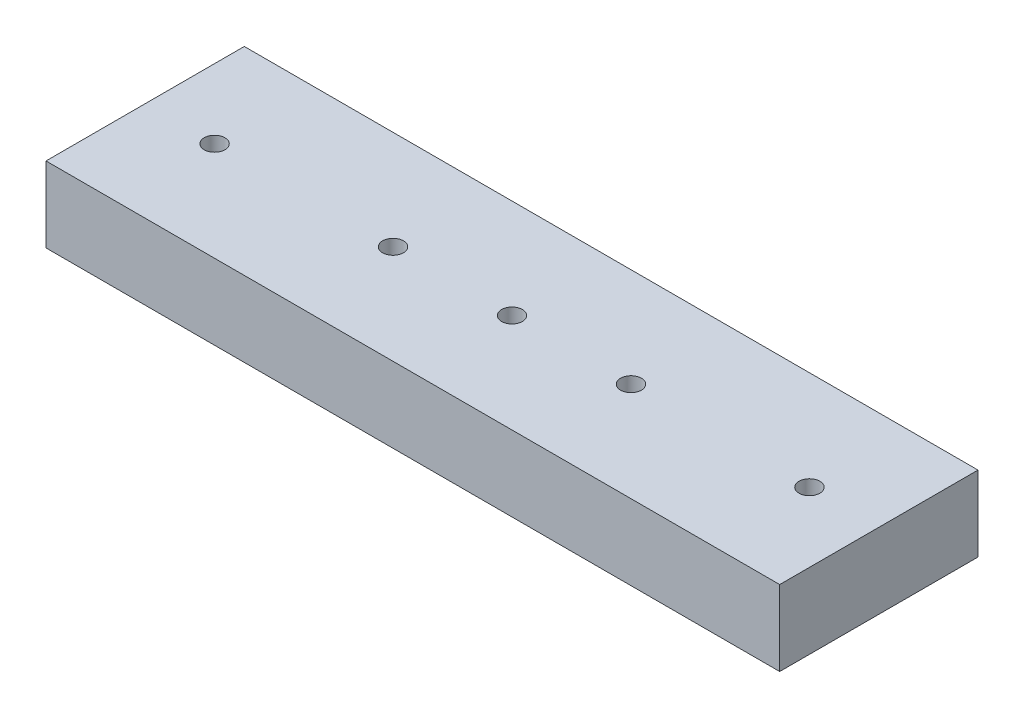
ISO-10303-21;
HEADER;
FILE_DESCRIPTION(('STEP AP214'),'2;1');
FILE_NAME('part.step','',(''),(''),'','','');
FILE_SCHEMA(('AUTOMOTIVE_DESIGN { 1 0 10303 214 1 1 1 1 }'));
ENDSEC;
DATA;
#1=APPLICATION_CONTEXT('core data for automotive mechanical design processes');
#2=APPLICATION_PROTOCOL_DEFINITION('international standard','automotive_design',2000,#1);
#3=PRODUCT_CONTEXT('',#1,'mechanical');
#4=PRODUCT('Part','Part','',(#3));
#5=PRODUCT_RELATED_PRODUCT_CATEGORY('part','',(#4));
#6=PRODUCT_DEFINITION_FORMATION('','',#4);
#7=PRODUCT_DEFINITION_CONTEXT('part definition',#1,'design');
#8=PRODUCT_DEFINITION('design','',#6,#7);
#9=PRODUCT_DEFINITION_SHAPE('','',#8);
#10=(LENGTH_UNIT() NAMED_UNIT(*) SI_UNIT(.MILLI.,.METRE.));
#11=(NAMED_UNIT(*) PLANE_ANGLE_UNIT() SI_UNIT($,.RADIAN.));
#12=(NAMED_UNIT(*) SI_UNIT($,.STERADIAN.) SOLID_ANGLE_UNIT());
#13=UNCERTAINTY_MEASURE_WITH_UNIT(LENGTH_MEASURE(1.E-05),#10,'distance_accuracy_value','');
#14=(GEOMETRIC_REPRESENTATION_CONTEXT(3) GLOBAL_UNCERTAINTY_ASSIGNED_CONTEXT((#13)) GLOBAL_UNIT_ASSIGNED_CONTEXT((#10,
#11,#12)) REPRESENTATION_CONTEXT('',''));
#15=CARTESIAN_POINT('',(0.,0.,0.));
#16=DIRECTION('',(0.,0.,1.));
#17=DIRECTION('',(1.,0.,0.));
#18=AXIS2_PLACEMENT_3D('',#15,#16,#17);
#19=CARTESIAN_POINT('',(-185.,38.,50.));
#20=DIRECTION('',(1.,0.,0.));
#21=DIRECTION('',(0.,0.,-1.));
#22=AXIS2_PLACEMENT_3D('',#19,#20,#21);
#23=PLANE('',#22);
#24=DIRECTION('',(0.,0.,1.));
#25=VECTOR('',#24,1.);
#26=CARTESIAN_POINT('',(-185.,0.,50.));
#27=LINE('',#26,#25);
#28=CARTESIAN_POINT('',(-185.,0.,-50.));
#29=VERTEX_POINT('',#28);
#30=CARTESIAN_POINT('',(-185.,0.,50.));
#31=VERTEX_POINT('',#30);
#32=EDGE_CURVE('E100',#29,#31,#27,.T.);
#33=ORIENTED_EDGE('',*,*,#32,.T.);
#34=DIRECTION('',(0.,-1.,0.));
#35=VECTOR('',#34,1.);
#36=CARTESIAN_POINT('',(-185.,38.,50.));
#37=LINE('',#36,#35);
#38=CARTESIAN_POINT('',(-185.,38.,50.));
#39=VERTEX_POINT('',#38);
#40=EDGE_CURVE('E11',#39,#31,#37,.T.);
#41=ORIENTED_EDGE('',*,*,#40,.F.);
#42=DIRECTION('',(0.,0.,1.));
#43=VECTOR('',#42,1.);
#44=CARTESIAN_POINT('',(-185.,38.,50.));
#45=LINE('',#44,#43);
#46=CARTESIAN_POINT('',(-185.,38.,-50.));
#47=VERTEX_POINT('',#46);
#48=EDGE_CURVE('E88',#47,#39,#45,.T.);
#49=ORIENTED_EDGE('',*,*,#48,.F.);
#50=DIRECTION('',(0.,-1.,0.));
#51=VECTOR('',#50,1.);
#52=CARTESIAN_POINT('',(-185.,38.,-50.));
#53=LINE('',#52,#51);
#54=EDGE_CURVE('E96',#47,#29,#53,.T.);
#55=ORIENTED_EDGE('',*,*,#54,.T.);
#56=EDGE_LOOP('',(#33,#41,#49,#55));
#57=FACE_BOUND('',#56,.T.);
#58=ADVANCED_FACE('F37',(#57),#23,.F.);
#59=CARTESIAN_POINT('',(185.,38.,50.));
#60=DIRECTION('',(0.,0.,-1.));
#61=DIRECTION('',(-1.,0.,0.));
#62=AXIS2_PLACEMENT_3D('',#59,#60,#61);
#63=PLANE('',#62);
#64=DIRECTION('',(1.,0.,0.));
#65=VECTOR('',#64,1.);
#66=CARTESIAN_POINT('',(185.,0.,50.));
#67=LINE('',#66,#65);
#68=CARTESIAN_POINT('',(185.,0.,50.));
#69=VERTEX_POINT('',#68);
#70=EDGE_CURVE('E92',#31,#69,#67,.T.);
#71=ORIENTED_EDGE('',*,*,#70,.T.);
#72=DIRECTION('',(0.,-1.,0.));
#73=VECTOR('',#72,1.);
#74=CARTESIAN_POINT('',(185.,38.,50.));
#75=LINE('',#74,#73);
#76=CARTESIAN_POINT('',(185.,38.,50.));
#77=VERTEX_POINT('',#76);
#78=EDGE_CURVE('E45',#77,#69,#75,.T.);
#79=ORIENTED_EDGE('',*,*,#78,.F.);
#80=DIRECTION('',(1.,0.,0.));
#81=VECTOR('',#80,1.);
#82=CARTESIAN_POINT('',(185.,38.,50.));
#83=LINE('',#82,#81);
#84=EDGE_CURVE('E83',#39,#77,#83,.T.);
#85=ORIENTED_EDGE('',*,*,#84,.F.);
#86=ORIENTED_EDGE('',*,*,#40,.T.);
#87=EDGE_LOOP('',(#71,#79,#85,#86));
#88=FACE_BOUND('',#87,.T.);
#89=ADVANCED_FACE('F91',(#88),#63,.F.);
#90=CARTESIAN_POINT('',(185.,38.,50.));
#91=DIRECTION('',(-1.,0.,0.));
#92=DIRECTION('',(0.,0.,1.));
#93=AXIS2_PLACEMENT_3D('',#90,#91,#92);
#94=PLANE('',#93);
#95=DIRECTION('',(0.,0.,-1.));
#96=VECTOR('',#95,1.);
#97=CARTESIAN_POINT('',(185.,0.,50.));
#98=LINE('',#97,#96);
#99=CARTESIAN_POINT('',(185.,0.,-50.));
#100=VERTEX_POINT('',#99);
#101=EDGE_CURVE('E70',#69,#100,#98,.T.);
#102=ORIENTED_EDGE('',*,*,#101,.T.);
#103=DIRECTION('',(0.,-1.,0.));
#104=VECTOR('',#103,1.);
#105=CARTESIAN_POINT('',(185.,38.,-50.));
#106=LINE('',#105,#104);
#107=CARTESIAN_POINT('',(185.,38.,-50.));
#108=VERTEX_POINT('',#107);
#109=EDGE_CURVE('E93',#108,#100,#106,.T.);
#110=ORIENTED_EDGE('',*,*,#109,.F.);
#111=DIRECTION('',(0.,0.,-1.));
#112=VECTOR('',#111,1.);
#113=CARTESIAN_POINT('',(185.,38.,50.));
#114=LINE('',#113,#112);
#115=EDGE_CURVE('E86',#77,#108,#114,.T.);
#116=ORIENTED_EDGE('',*,*,#115,.F.);
#117=ORIENTED_EDGE('',*,*,#78,.T.);
#118=EDGE_LOOP('',(#102,#110,#116,#117));
#119=FACE_BOUND('',#118,.T.);
#120=ADVANCED_FACE('F94',(#119),#94,.F.);
#121=CARTESIAN_POINT('',(185.,38.,-50.));
#122=DIRECTION('',(0.,0.,1.));
#123=DIRECTION('',(1.,0.,0.));
#124=AXIS2_PLACEMENT_3D('',#121,#122,#123);
#125=PLANE('',#124);
#126=DIRECTION('',(-1.,0.,0.));
#127=VECTOR('',#126,1.);
#128=CARTESIAN_POINT('',(185.,0.,-50.));
#129=LINE('',#128,#127);
#130=EDGE_CURVE('E76',#100,#29,#129,.T.);
#131=ORIENTED_EDGE('',*,*,#130,.T.);
#132=ORIENTED_EDGE('',*,*,#54,.F.);
#133=DIRECTION('',(-1.,0.,0.));
#134=VECTOR('',#133,1.);
#135=CARTESIAN_POINT('',(185.,38.,-50.));
#136=LINE('',#135,#134);
#137=EDGE_CURVE('E53',#108,#47,#136,.T.);
#138=ORIENTED_EDGE('',*,*,#137,.F.);
#139=ORIENTED_EDGE('',*,*,#109,.T.);
#140=EDGE_LOOP('',(#131,#132,#138,#139));
#141=FACE_BOUND('',#140,.T.);
#142=ADVANCED_FACE('F108',(#141),#125,.F.);
#143=CARTESIAN_POINT('',(0.,38.,0.));
#144=DIRECTION('',(0.,1.,0.));
#145=DIRECTION('',(0.,0.,1.));
#146=AXIS2_PLACEMENT_3D('',#143,#144,#145);
#147=PLANE('',#146);
#148=CARTESIAN_POINT('',(150.,38.,0.));
#149=DIRECTION('',(0.,1.,0.));
#150=DIRECTION('',(0.,0.,1.));
#151=AXIS2_PLACEMENT_3D('',#148,#149,#150);
#152=CIRCLE('',#151,5.25);
#153=CARTESIAN_POINT('',(150.,38.,5.24999999999996));
#154=VERTEX_POINT('',#153);
#155=EDGE_CURVE('E137',#154,#154,#152,.T.);
#156=ORIENTED_EDGE('',*,*,#155,.F.);
#157=EDGE_LOOP('',(#156));
#158=FACE_BOUND('',#157,.T.);
#159=CARTESIAN_POINT('',(60.0000000000001,38.,0.));
#160=DIRECTION('',(0.,1.,0.));
#161=DIRECTION('',(0.,0.,1.));
#162=AXIS2_PLACEMENT_3D('',#159,#160,#161);
#163=CIRCLE('',#162,5.25);
#164=CARTESIAN_POINT('',(60.0000000000001,38.,5.24999999999997));
#165=VERTEX_POINT('',#164);
#166=EDGE_CURVE('E131',#165,#165,#163,.T.);
#167=ORIENTED_EDGE('',*,*,#166,.F.);
#168=EDGE_LOOP('',(#167));
#169=FACE_BOUND('',#168,.T.);
#170=CARTESIAN_POINT('',(0.,38.,0.));
#171=DIRECTION('',(0.,1.,0.));
#172=DIRECTION('',(0.,0.,1.));
#173=AXIS2_PLACEMENT_3D('',#170,#171,#172);
#174=CIRCLE('',#173,5.25);
#175=CARTESIAN_POINT('',(0.,38.,5.24999999999998));
#176=VERTEX_POINT('',#175);
#177=EDGE_CURVE('E125',#176,#176,#174,.T.);
#178=ORIENTED_EDGE('',*,*,#177,.F.);
#179=EDGE_LOOP('',(#178));
#180=FACE_BOUND('',#179,.T.);
#181=CARTESIAN_POINT('',(-59.9999999999999,38.,0.));
#182=DIRECTION('',(0.,1.,0.));
#183=DIRECTION('',(0.,0.,1.));
#184=AXIS2_PLACEMENT_3D('',#181,#182,#183);
#185=CIRCLE('',#184,5.25);
#186=CARTESIAN_POINT('',(-59.9999999999999,38.,5.24999999999999));
#187=VERTEX_POINT('',#186);
#188=EDGE_CURVE('E119',#187,#187,#185,.T.);
#189=ORIENTED_EDGE('',*,*,#188,.F.);
#190=EDGE_LOOP('',(#189));
#191=FACE_BOUND('',#190,.T.);
#192=CARTESIAN_POINT('',(-150.,38.,0.));
#193=DIRECTION('',(0.,1.,0.));
#194=DIRECTION('',(0.,0.,1.));
#195=AXIS2_PLACEMENT_3D('',#192,#193,#194);
#196=CIRCLE('',#195,5.25);
#197=CARTESIAN_POINT('',(-150.,38.,5.25));
#198=VERTEX_POINT('',#197);
#199=EDGE_CURVE('E116',#198,#198,#196,.T.);
#200=ORIENTED_EDGE('',*,*,#199,.F.);
#201=EDGE_LOOP('',(#200));
#202=FACE_BOUND('',#201,.T.);
#203=ORIENTED_EDGE('',*,*,#48,.T.);
#204=ORIENTED_EDGE('',*,*,#84,.T.);
#205=ORIENTED_EDGE('',*,*,#115,.T.);
#206=ORIENTED_EDGE('',*,*,#137,.T.);
#207=EDGE_LOOP('',(#203,#204,#205,#206));
#208=FACE_BOUND('',#207,.T.);
#209=ADVANCED_FACE('F84',(#158,#169,#180,#191,#202,#208),#147,.T.);
#210=CARTESIAN_POINT('',(0.,0.,0.));
#211=DIRECTION('',(0.,1.,0.));
#212=DIRECTION('',(0.,0.,1.));
#213=AXIS2_PLACEMENT_3D('',#210,#211,#212);
#214=PLANE('',#213);
#215=CARTESIAN_POINT('',(150.,0.,0.));
#216=DIRECTION('',(0.,1.,0.));
#217=DIRECTION('',(0.,0.,1.));
#218=AXIS2_PLACEMENT_3D('',#215,#216,#217);
#219=CIRCLE('',#218,5.25);
#220=CARTESIAN_POINT('',(150.,0.,5.24999999999996));
#221=VERTEX_POINT('',#220);
#222=EDGE_CURVE('E140',#221,#221,#219,.T.);
#223=ORIENTED_EDGE('',*,*,#222,.T.);
#224=EDGE_LOOP('',(#223));
#225=FACE_BOUND('',#224,.T.);
#226=CARTESIAN_POINT('',(60.0000000000001,0.,0.));
#227=DIRECTION('',(0.,1.,0.));
#228=DIRECTION('',(0.,0.,1.));
#229=AXIS2_PLACEMENT_3D('',#226,#227,#228);
#230=CIRCLE('',#229,5.25);
#231=CARTESIAN_POINT('',(60.0000000000001,0.,5.24999999999997));
#232=VERTEX_POINT('',#231);
#233=EDGE_CURVE('E134',#232,#232,#230,.T.);
#234=ORIENTED_EDGE('',*,*,#233,.T.);
#235=EDGE_LOOP('',(#234));
#236=FACE_BOUND('',#235,.T.);
#237=CARTESIAN_POINT('',(0.,0.,0.));
#238=DIRECTION('',(0.,1.,0.));
#239=DIRECTION('',(0.,0.,1.));
#240=AXIS2_PLACEMENT_3D('',#237,#238,#239);
#241=CIRCLE('',#240,5.25);
#242=CARTESIAN_POINT('',(0.,0.,5.24999999999998));
#243=VERTEX_POINT('',#242);
#244=EDGE_CURVE('E128',#243,#243,#241,.T.);
#245=ORIENTED_EDGE('',*,*,#244,.T.);
#246=EDGE_LOOP('',(#245));
#247=FACE_BOUND('',#246,.T.);
#248=CARTESIAN_POINT('',(-59.9999999999999,0.,0.));
#249=DIRECTION('',(0.,1.,0.));
#250=DIRECTION('',(0.,0.,1.));
#251=AXIS2_PLACEMENT_3D('',#248,#249,#250);
#252=CIRCLE('',#251,5.25);
#253=CARTESIAN_POINT('',(-59.9999999999999,0.,5.24999999999999));
#254=VERTEX_POINT('',#253);
#255=EDGE_CURVE('E122',#254,#254,#252,.T.);
#256=ORIENTED_EDGE('',*,*,#255,.T.);
#257=EDGE_LOOP('',(#256));
#258=FACE_BOUND('',#257,.T.);
#259=CARTESIAN_POINT('',(-150.,0.,0.));
#260=DIRECTION('',(0.,1.,0.));
#261=DIRECTION('',(0.,0.,1.));
#262=AXIS2_PLACEMENT_3D('',#259,#260,#261);
#263=CIRCLE('',#262,5.25);
#264=CARTESIAN_POINT('',(-150.,0.,5.25));
#265=VERTEX_POINT('',#264);
#266=EDGE_CURVE('E103',#265,#265,#263,.T.);
#267=ORIENTED_EDGE('',*,*,#266,.T.);
#268=EDGE_LOOP('',(#267));
#269=FACE_BOUND('',#268,.T.);
#270=ORIENTED_EDGE('',*,*,#32,.F.);
#271=ORIENTED_EDGE('',*,*,#130,.F.);
#272=ORIENTED_EDGE('',*,*,#101,.F.);
#273=ORIENTED_EDGE('',*,*,#70,.F.);
#274=EDGE_LOOP('',(#270,#271,#272,#273));
#275=FACE_BOUND('',#274,.T.);
#276=ADVANCED_FACE('F111',(#225,#236,#247,#258,#269,#275),#214,.F.);
#277=CARTESIAN_POINT('',(-150.,38.,0.));
#278=DIRECTION('',(0.,1.,0.));
#279=DIRECTION('',(0.,0.,1.));
#280=AXIS2_PLACEMENT_3D('',#277,#278,#279);
#281=CYLINDRICAL_SURFACE('',#280,5.25);
#282=ORIENTED_EDGE('',*,*,#266,.F.);
#283=EDGE_LOOP('',(#282));
#284=FACE_BOUND('',#283,.T.);
#285=ORIENTED_EDGE('',*,*,#199,.T.);
#286=EDGE_LOOP('',(#285));
#287=FACE_BOUND('',#286,.T.);
#288=ADVANCED_FACE('F164',(#284,#287),#281,.F.);
#289=CARTESIAN_POINT('',(-59.9999999999999,38.,0.));
#290=DIRECTION('',(0.,1.,0.));
#291=DIRECTION('',(0.,0.,1.));
#292=AXIS2_PLACEMENT_3D('',#289,#290,#291);
#293=CYLINDRICAL_SURFACE('',#292,5.25);
#294=ORIENTED_EDGE('',*,*,#255,.F.);
#295=EDGE_LOOP('',(#294));
#296=FACE_BOUND('',#295,.T.);
#297=ORIENTED_EDGE('',*,*,#188,.T.);
#298=EDGE_LOOP('',(#297));
#299=FACE_BOUND('',#298,.T.);
#300=ADVANCED_FACE('F166',(#296,#299),#293,.F.);
#301=CARTESIAN_POINT('',(0.,38.,0.));
#302=DIRECTION('',(0.,1.,0.));
#303=DIRECTION('',(0.,0.,1.));
#304=AXIS2_PLACEMENT_3D('',#301,#302,#303);
#305=CYLINDRICAL_SURFACE('',#304,5.25);
#306=ORIENTED_EDGE('',*,*,#244,.F.);
#307=EDGE_LOOP('',(#306));
#308=FACE_BOUND('',#307,.T.);
#309=ORIENTED_EDGE('',*,*,#177,.T.);
#310=EDGE_LOOP('',(#309));
#311=FACE_BOUND('',#310,.T.);
#312=ADVANCED_FACE('F173',(#308,#311),#305,.F.);
#313=CARTESIAN_POINT('',(60.0000000000001,38.,0.));
#314=DIRECTION('',(0.,1.,0.));
#315=DIRECTION('',(0.,0.,1.));
#316=AXIS2_PLACEMENT_3D('',#313,#314,#315);
#317=CYLINDRICAL_SURFACE('',#316,5.25);
#318=ORIENTED_EDGE('',*,*,#233,.F.);
#319=EDGE_LOOP('',(#318));
#320=FACE_BOUND('',#319,.T.);
#321=ORIENTED_EDGE('',*,*,#166,.T.);
#322=EDGE_LOOP('',(#321));
#323=FACE_BOUND('',#322,.T.);
#324=ADVANCED_FACE('F149',(#320,#323),#317,.F.);
#325=CARTESIAN_POINT('',(150.,38.,0.));
#326=DIRECTION('',(0.,1.,0.));
#327=DIRECTION('',(0.,0.,1.));
#328=AXIS2_PLACEMENT_3D('',#325,#326,#327);
#329=CYLINDRICAL_SURFACE('',#328,5.25);
#330=ORIENTED_EDGE('',*,*,#222,.F.);
#331=EDGE_LOOP('',(#330));
#332=FACE_BOUND('',#331,.T.);
#333=ORIENTED_EDGE('',*,*,#155,.T.);
#334=EDGE_LOOP('',(#333));
#335=FACE_BOUND('',#334,.T.);
#336=ADVANCED_FACE('F146',(#332,#335),#329,.F.);
#337=CLOSED_SHELL('',(#58,#89,#120,#142,#209,#276,#288,#300,#312,#324,#336));
#338=MANIFOLD_SOLID_BREP('B2',#337);
#339=ADVANCED_BREP_SHAPE_REPRESENTATION('',(#18,#338),#14);
#340=SHAPE_DEFINITION_REPRESENTATION(#9,#339);
ENDSEC;
END-ISO-10303-21;
